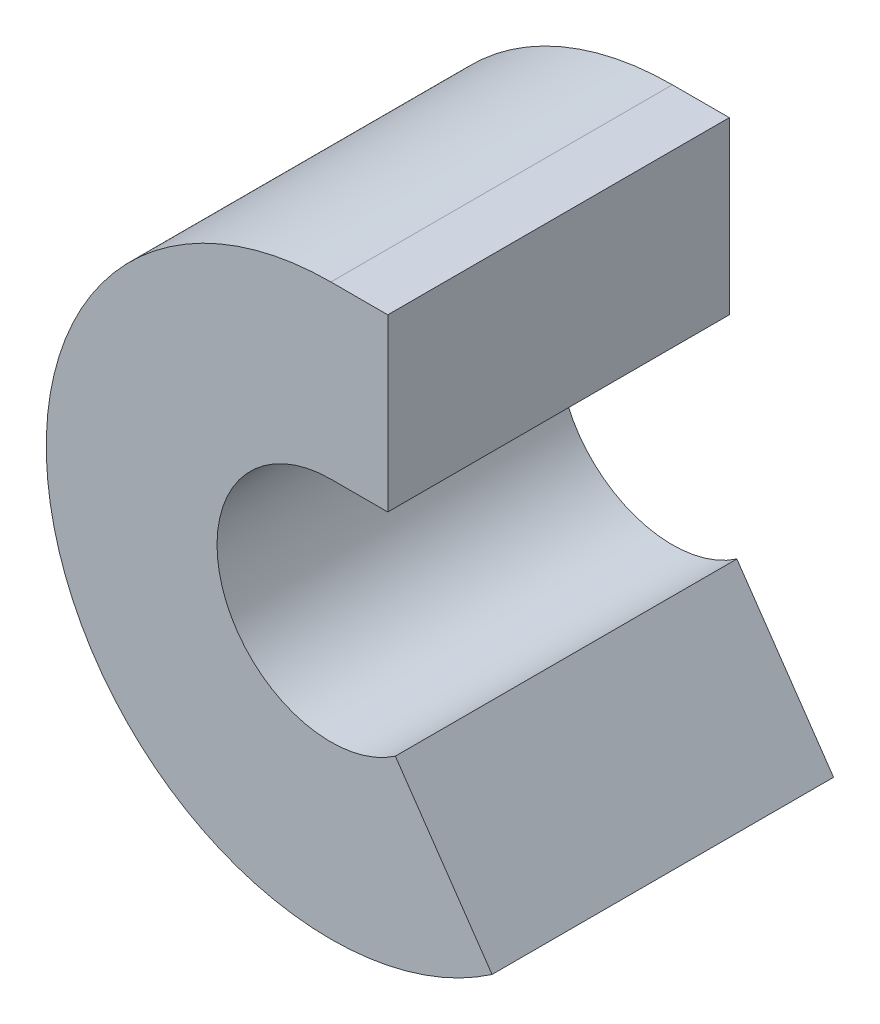
ISO-10303-21;
HEADER;
FILE_DESCRIPTION(('STEP AP214'),'2;1');
FILE_NAME('part.step','',(''),(''),'','','');
FILE_SCHEMA(('AUTOMOTIVE_DESIGN { 1 0 10303 214 1 1 1 1 }'));
ENDSEC;
DATA;
#1=APPLICATION_CONTEXT('core data for automotive mechanical design processes');
#2=APPLICATION_PROTOCOL_DEFINITION('international standard','automotive_design',2000,#1);
#3=PRODUCT_CONTEXT('',#1,'mechanical');
#4=PRODUCT('Part','Part','',(#3));
#5=PRODUCT_RELATED_PRODUCT_CATEGORY('part','',(#4));
#6=PRODUCT_DEFINITION_FORMATION('','',#4);
#7=PRODUCT_DEFINITION_CONTEXT('part definition',#1,'design');
#8=PRODUCT_DEFINITION('design','',#6,#7);
#9=PRODUCT_DEFINITION_SHAPE('','',#8);
#10=(LENGTH_UNIT() NAMED_UNIT(*) SI_UNIT(.MILLI.,.METRE.));
#11=(NAMED_UNIT(*) PLANE_ANGLE_UNIT() SI_UNIT($,.RADIAN.));
#12=(NAMED_UNIT(*) SI_UNIT($,.STERADIAN.) SOLID_ANGLE_UNIT());
#13=UNCERTAINTY_MEASURE_WITH_UNIT(LENGTH_MEASURE(1.E-05),#10,'distance_accuracy_value','');
#14=(GEOMETRIC_REPRESENTATION_CONTEXT(3) GLOBAL_UNCERTAINTY_ASSIGNED_CONTEXT((#13)) GLOBAL_UNIT_ASSIGNED_CONTEXT((#10,
#11,#12)) REPRESENTATION_CONTEXT('',''));
#15=CARTESIAN_POINT('',(0.,0.,0.));
#16=DIRECTION('',(0.,0.,1.));
#17=DIRECTION('',(1.,0.,0.));
#18=AXIS2_PLACEMENT_3D('',#15,#16,#17);
#19=CARTESIAN_POINT('',(0.,63.5000000000003,76.2));
#20=DIRECTION('',(0.,1.,0.));
#21=DIRECTION('',(-1.,0.,0.));
#22=AXIS2_PLACEMENT_3D('',#19,#20,#21);
#23=PLANE('',#22);
#24=DIRECTION('',(1.,0.,0.));
#25=VECTOR('',#24,1.);
#26=CARTESIAN_POINT('',(0.,63.5000000000003,0.));
#27=LINE('',#26,#25);
#28=CARTESIAN_POINT('',(-263.258240929237,63.5,0.));
#29=VERTEX_POINT('',#28);
#30=CARTESIAN_POINT('',(-250.558240929237,63.5,0.));
#31=VERTEX_POINT('',#30);
#32=EDGE_CURVE('E118',#29,#31,#27,.T.);
#33=ORIENTED_EDGE('',*,*,#32,.F.);
#34=DIRECTION('',(0.,0.,-1.));
#35=VECTOR('',#34,1.);
#36=CARTESIAN_POINT('',(-263.258240929237,63.5,76.2));
#37=LINE('',#36,#35);
#38=CARTESIAN_POINT('',(-263.258240929237,63.5,76.2));
#39=VERTEX_POINT('',#38);
#40=EDGE_CURVE('E11',#39,#29,#37,.T.);
#41=ORIENTED_EDGE('',*,*,#40,.F.);
#42=DIRECTION('',(1.,0.,0.));
#43=VECTOR('',#42,1.);
#44=CARTESIAN_POINT('',(0.,63.5000000000003,76.2));
#45=LINE('',#44,#43);
#46=CARTESIAN_POINT('',(-250.558240929237,63.5,76.2));
#47=VERTEX_POINT('',#46);
#48=EDGE_CURVE('E132',#39,#47,#45,.T.);
#49=ORIENTED_EDGE('',*,*,#48,.T.);
#50=DIRECTION('',(0.,0.,-1.));
#51=VECTOR('',#50,1.);
#52=CARTESIAN_POINT('',(-250.558240929237,63.5,76.2));
#53=LINE('',#52,#51);
#54=EDGE_CURVE('E51',#47,#31,#53,.T.);
#55=ORIENTED_EDGE('',*,*,#54,.T.);
#56=EDGE_LOOP('',(#33,#41,#49,#55));
#57=FACE_BOUND('',#56,.T.);
#58=ADVANCED_FACE('F35',(#57),#23,.T.);
#59=CARTESIAN_POINT('',(-263.258240929237,0.,76.2));
#60=DIRECTION('',(0.,0.,-1.));
#61=DIRECTION('',(-1.,0.,0.));
#62=AXIS2_PLACEMENT_3D('',#59,#60,#61);
#63=CYLINDRICAL_SURFACE('',#62,63.5);
#64=CARTESIAN_POINT('',(-263.258240929237,0.,0.));
#65=DIRECTION('',(0.,0.,1.));
#66=DIRECTION('',(1.,0.,0.));
#67=AXIS2_PLACEMENT_3D('',#64,#65,#66);
#68=CIRCLE('',#67,63.5);
#69=CARTESIAN_POINT('',(-227.290164194002,-52.3311327602249,0.));
#70=VERTEX_POINT('',#69);
#71=EDGE_CURVE('E120',#29,#70,#68,.T.);
#72=ORIENTED_EDGE('',*,*,#71,.T.);
#73=DIRECTION('',(0.,0.,-1.));
#74=VECTOR('',#73,1.);
#75=CARTESIAN_POINT('',(-227.290164194002,-52.3311327602249,76.2));
#76=LINE('',#75,#74);
#77=CARTESIAN_POINT('',(-227.290164194002,-52.3311327602249,76.2));
#78=VERTEX_POINT('',#77);
#79=EDGE_CURVE('E43',#78,#70,#76,.T.);
#80=ORIENTED_EDGE('',*,*,#79,.F.);
#81=CARTESIAN_POINT('',(-263.258240929237,0.,76.2));
#82=DIRECTION('',(0.,0.,1.));
#83=DIRECTION('',(1.,0.,0.));
#84=AXIS2_PLACEMENT_3D('',#81,#82,#83);
#85=CIRCLE('',#84,63.5);
#86=EDGE_CURVE('E113',#39,#78,#85,.T.);
#87=ORIENTED_EDGE('',*,*,#86,.F.);
#88=ORIENTED_EDGE('',*,*,#40,.T.);
#89=EDGE_LOOP('',(#72,#80,#87,#88));
#90=FACE_BOUND('',#89,.T.);
#91=ADVANCED_FACE('F141',(#90),#63,.T.);
#92=CARTESIAN_POINT('',(-178.79476370747,-122.888679103394,76.2));
#93=DIRECTION('',(0.824112326932676,0.566426405279283,0.));
#94=DIRECTION('',(-0.566426405279283,0.824112326932676,0.));
#95=AXIS2_PLACEMENT_3D('',#92,#93,#94);
#96=PLANE('',#95);
#97=DIRECTION('',(0.566426405279283,-0.824112326932676,0.));
#98=VECTOR('',#97,1.);
#99=CARTESIAN_POINT('',(-178.79476370747,-122.888679103394,0.));
#100=LINE('',#99,#98);
#101=CARTESIAN_POINT('',(-248.871010235143,-20.93245310409,0.));
#102=VERTEX_POINT('',#101);
#103=EDGE_CURVE('E123',#102,#70,#100,.T.);
#104=ORIENTED_EDGE('',*,*,#103,.F.);
#105=DIRECTION('',(0.,0.,-1.));
#106=VECTOR('',#105,1.);
#107=CARTESIAN_POINT('',(-248.871010235143,-20.93245310409,76.2));
#108=LINE('',#107,#106);
#109=CARTESIAN_POINT('',(-248.871010235143,-20.93245310409,76.2));
#110=VERTEX_POINT('',#109);
#111=EDGE_CURVE('E99',#110,#102,#108,.T.);
#112=ORIENTED_EDGE('',*,*,#111,.F.);
#113=DIRECTION('',(0.566426405279283,-0.824112326932676,0.));
#114=VECTOR('',#113,1.);
#115=CARTESIAN_POINT('',(-178.79476370747,-122.888679103394,76.2));
#116=LINE('',#115,#114);
#117=EDGE_CURVE('E111',#110,#78,#116,.T.);
#118=ORIENTED_EDGE('',*,*,#117,.T.);
#119=ORIENTED_EDGE('',*,*,#79,.T.);
#120=EDGE_LOOP('',(#104,#112,#118,#119));
#121=FACE_BOUND('',#120,.T.);
#122=ADVANCED_FACE('F138',(#121),#96,.T.);
#123=CARTESIAN_POINT('',(-263.258240929237,0.,76.2));
#124=DIRECTION('',(0.,0.,-1.));
#125=DIRECTION('',(-1.,0.,0.));
#126=AXIS2_PLACEMENT_3D('',#123,#124,#125);
#127=CYLINDRICAL_SURFACE('',#126,25.4);
#128=CARTESIAN_POINT('',(-263.258240929237,0.,0.));
#129=DIRECTION('',(0.,0.,1.));
#130=DIRECTION('',(1.,0.,0.));
#131=AXIS2_PLACEMENT_3D('',#128,#129,#130);
#132=CIRCLE('',#131,25.4);
#133=CARTESIAN_POINT('',(-263.258240929237,25.4,0.));
#134=VERTEX_POINT('',#133);
#135=EDGE_CURVE('E96',#134,#102,#132,.T.);
#136=ORIENTED_EDGE('',*,*,#135,.F.);
#137=DIRECTION('',(0.,0.,-1.));
#138=VECTOR('',#137,1.);
#139=CARTESIAN_POINT('',(-263.258240929237,25.4,76.2));
#140=LINE('',#139,#138);
#141=CARTESIAN_POINT('',(-263.258240929237,25.4,76.2));
#142=VERTEX_POINT('',#141);
#143=EDGE_CURVE('E90',#142,#134,#140,.T.);
#144=ORIENTED_EDGE('',*,*,#143,.F.);
#145=CARTESIAN_POINT('',(-263.258240929237,0.,76.2));
#146=DIRECTION('',(0.,0.,1.));
#147=DIRECTION('',(1.,0.,0.));
#148=AXIS2_PLACEMENT_3D('',#145,#146,#147);
#149=CIRCLE('',#148,25.4);
#150=EDGE_CURVE('E94',#142,#110,#149,.T.);
#151=ORIENTED_EDGE('',*,*,#150,.T.);
#152=ORIENTED_EDGE('',*,*,#111,.T.);
#153=EDGE_LOOP('',(#136,#144,#151,#152));
#154=FACE_BOUND('',#153,.T.);
#155=ADVANCED_FACE('F92',(#154),#127,.F.);
#156=CARTESIAN_POINT('',(0.,25.4,76.2));
#157=DIRECTION('',(0.,1.,0.));
#158=DIRECTION('',(0.,0.,1.));
#159=AXIS2_PLACEMENT_3D('',#156,#157,#158);
#160=PLANE('',#159);
#161=DIRECTION('',(1.,0.,0.));
#162=VECTOR('',#161,1.);
#163=CARTESIAN_POINT('',(0.,25.4,0.));
#164=LINE('',#163,#162);
#165=CARTESIAN_POINT('',(-250.558240929237,25.4,0.));
#166=VERTEX_POINT('',#165);
#167=EDGE_CURVE('E127',#134,#166,#164,.T.);
#168=ORIENTED_EDGE('',*,*,#167,.T.);
#169=DIRECTION('',(0.,0.,-1.));
#170=VECTOR('',#169,1.);
#171=CARTESIAN_POINT('',(-250.558240929237,25.4,76.2));
#172=LINE('',#171,#170);
#173=CARTESIAN_POINT('',(-250.558240929237,25.4,76.2));
#174=VERTEX_POINT('',#173);
#175=EDGE_CURVE('E71',#174,#166,#172,.T.);
#176=ORIENTED_EDGE('',*,*,#175,.F.);
#177=DIRECTION('',(1.,0.,0.));
#178=VECTOR('',#177,1.);
#179=CARTESIAN_POINT('',(0.,25.4,76.2));
#180=LINE('',#179,#178);
#181=EDGE_CURVE('E101',#142,#174,#180,.T.);
#182=ORIENTED_EDGE('',*,*,#181,.F.);
#183=ORIENTED_EDGE('',*,*,#143,.T.);
#184=EDGE_LOOP('',(#168,#176,#182,#183));
#185=FACE_BOUND('',#184,.T.);
#186=ADVANCED_FACE('F102',(#185),#160,.F.);
#187=CARTESIAN_POINT('',(-250.558240929237,0.,76.2));
#188=DIRECTION('',(1.,0.,0.));
#189=DIRECTION('',(0.,0.,-1.));
#190=AXIS2_PLACEMENT_3D('',#187,#188,#189);
#191=PLANE('',#190);
#192=DIRECTION('',(0.,-1.,0.));
#193=VECTOR('',#192,1.);
#194=CARTESIAN_POINT('',(-250.558240929237,0.,0.));
#195=LINE('',#194,#193);
#196=EDGE_CURVE('E129',#31,#166,#195,.T.);
#197=ORIENTED_EDGE('',*,*,#196,.F.);
#198=ORIENTED_EDGE('',*,*,#54,.F.);
#199=DIRECTION('',(0.,-1.,0.));
#200=VECTOR('',#199,1.);
#201=CARTESIAN_POINT('',(-250.558240929237,0.,76.2));
#202=LINE('',#201,#200);
#203=EDGE_CURVE('E105',#47,#174,#202,.T.);
#204=ORIENTED_EDGE('',*,*,#203,.T.);
#205=ORIENTED_EDGE('',*,*,#175,.T.);
#206=EDGE_LOOP('',(#197,#198,#204,#205));
#207=FACE_BOUND('',#206,.T.);
#208=ADVANCED_FACE('F144',(#207),#191,.T.);
#209=CARTESIAN_POINT('',(0.,0.,76.2));
#210=DIRECTION('',(0.,0.,1.));
#211=DIRECTION('',(1.,0.,0.));
#212=AXIS2_PLACEMENT_3D('',#209,#210,#211);
#213=PLANE('',#212);
#214=ORIENTED_EDGE('',*,*,#48,.F.);
#215=ORIENTED_EDGE('',*,*,#86,.T.);
#216=ORIENTED_EDGE('',*,*,#117,.F.);
#217=ORIENTED_EDGE('',*,*,#150,.F.);
#218=ORIENTED_EDGE('',*,*,#181,.T.);
#219=ORIENTED_EDGE('',*,*,#203,.F.);
#220=EDGE_LOOP('',(#214,#215,#216,#217,#218,#219));
#221=FACE_BOUND('',#220,.T.);
#222=ADVANCED_FACE('F109',(#221),#213,.T.);
#223=CARTESIAN_POINT('',(0.,0.,0.));
#224=DIRECTION('',(0.,0.,1.));
#225=DIRECTION('',(1.,0.,0.));
#226=AXIS2_PLACEMENT_3D('',#223,#224,#225);
#227=PLANE('',#226);
#228=ORIENTED_EDGE('',*,*,#32,.T.);
#229=ORIENTED_EDGE('',*,*,#196,.T.);
#230=ORIENTED_EDGE('',*,*,#167,.F.);
#231=ORIENTED_EDGE('',*,*,#135,.T.);
#232=ORIENTED_EDGE('',*,*,#103,.T.);
#233=ORIENTED_EDGE('',*,*,#71,.F.);
#234=EDGE_LOOP('',(#228,#229,#230,#231,#232,#233));
#235=FACE_BOUND('',#234,.T.);
#236=ADVANCED_FACE('F143',(#235),#227,.F.);
#237=CLOSED_SHELL('',(#58,#91,#122,#155,#186,#208,#222,#236));
#238=MANIFOLD_SOLID_BREP('B2',#237);
#239=ADVANCED_BREP_SHAPE_REPRESENTATION('',(#18,#238),#14);
#240=SHAPE_DEFINITION_REPRESENTATION(#9,#239);
ENDSEC;
END-ISO-10303-21;
